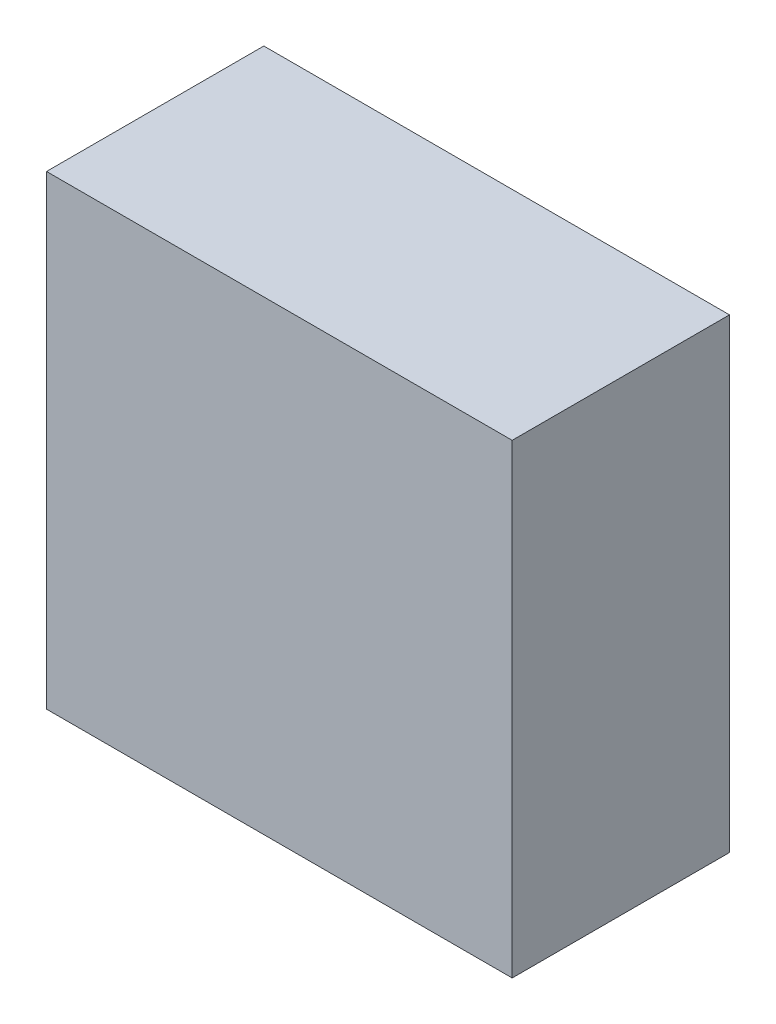
ISO-10303-21;
HEADER;
FILE_DESCRIPTION(('STEP AP214'),'2;1');
FILE_NAME('part.step','',(''),(''),'','','');
FILE_SCHEMA(('AUTOMOTIVE_DESIGN { 1 0 10303 214 1 1 1 1 }'));
ENDSEC;
DATA;
#1=APPLICATION_CONTEXT('core data for automotive mechanical design processes');
#2=APPLICATION_PROTOCOL_DEFINITION('international standard','automotive_design',2000,#1);
#3=PRODUCT_CONTEXT('',#1,'mechanical');
#4=PRODUCT('Part','Part','',(#3));
#5=PRODUCT_RELATED_PRODUCT_CATEGORY('part','',(#4));
#6=PRODUCT_DEFINITION_FORMATION('','',#4);
#7=PRODUCT_DEFINITION_CONTEXT('part definition',#1,'design');
#8=PRODUCT_DEFINITION('design','',#6,#7);
#9=PRODUCT_DEFINITION_SHAPE('','',#8);
#10=(LENGTH_UNIT() NAMED_UNIT(*) SI_UNIT(.MILLI.,.METRE.));
#11=(NAMED_UNIT(*) PLANE_ANGLE_UNIT() SI_UNIT($,.RADIAN.));
#12=(NAMED_UNIT(*) SI_UNIT($,.STERADIAN.) SOLID_ANGLE_UNIT());
#13=UNCERTAINTY_MEASURE_WITH_UNIT(LENGTH_MEASURE(1.E-05),#10,'distance_accuracy_value','');
#14=(GEOMETRIC_REPRESENTATION_CONTEXT(3) GLOBAL_UNCERTAINTY_ASSIGNED_CONTEXT((#13)) GLOBAL_UNIT_ASSIGNED_CONTEXT((#10,
#11,#12)) REPRESENTATION_CONTEXT('',''));
#15=CARTESIAN_POINT('',(0.,0.,0.));
#16=DIRECTION('',(0.,0.,1.));
#17=DIRECTION('',(1.,0.,0.));
#18=AXIS2_PLACEMENT_3D('',#15,#16,#17);
#19=CARTESIAN_POINT('',(0.,0.,35.));
#20=DIRECTION('',(1.,0.,0.));
#21=DIRECTION('',(0.,0.,-1.));
#22=AXIS2_PLACEMENT_3D('',#19,#20,#21);
#23=PLANE('',#22);
#24=DIRECTION('',(0.,-1.,0.));
#25=VECTOR('',#24,1.);
#26=CARTESIAN_POINT('',(0.,0.,0.));
#27=LINE('',#26,#25);
#28=CARTESIAN_POINT('',(0.,75.,0.));
#29=VERTEX_POINT('',#28);
#30=CARTESIAN_POINT('',(0.,0.,0.));
#31=VERTEX_POINT('',#30);
#32=EDGE_CURVE('E97',#29,#31,#27,.T.);
#33=ORIENTED_EDGE('',*,*,#32,.T.);
#34=DIRECTION('',(0.,0.,-1.));
#35=VECTOR('',#34,1.);
#36=CARTESIAN_POINT('',(0.,0.,35.));
#37=LINE('',#36,#35);
#38=CARTESIAN_POINT('',(0.,0.,35.));
#39=VERTEX_POINT('',#38);
#40=EDGE_CURVE('E11',#39,#31,#37,.T.);
#41=ORIENTED_EDGE('',*,*,#40,.F.);
#42=DIRECTION('',(0.,-1.,0.));
#43=VECTOR('',#42,1.);
#44=CARTESIAN_POINT('',(0.,0.,35.));
#45=LINE('',#44,#43);
#46=CARTESIAN_POINT('',(0.,75.,35.));
#47=VERTEX_POINT('',#46);
#48=EDGE_CURVE('E85',#47,#39,#45,.T.);
#49=ORIENTED_EDGE('',*,*,#48,.F.);
#50=DIRECTION('',(0.,0.,-1.));
#51=VECTOR('',#50,1.);
#52=CARTESIAN_POINT('',(0.,75.,35.));
#53=LINE('',#52,#51);
#54=EDGE_CURVE('E93',#47,#29,#53,.T.);
#55=ORIENTED_EDGE('',*,*,#54,.T.);
#56=EDGE_LOOP('',(#33,#41,#49,#55));
#57=FACE_BOUND('',#56,.T.);
#58=ADVANCED_FACE('F34',(#57),#23,.F.);
#59=CARTESIAN_POINT('',(0.,0.,35.));
#60=DIRECTION('',(0.,1.,0.));
#61=DIRECTION('',(0.,0.,1.));
#62=AXIS2_PLACEMENT_3D('',#59,#60,#61);
#63=PLANE('',#62);
#64=DIRECTION('',(1.,0.,0.));
#65=VECTOR('',#64,1.);
#66=CARTESIAN_POINT('',(0.,0.,0.));
#67=LINE('',#66,#65);
#68=CARTESIAN_POINT('',(75.,0.,0.));
#69=VERTEX_POINT('',#68);
#70=EDGE_CURVE('E89',#31,#69,#67,.T.);
#71=ORIENTED_EDGE('',*,*,#70,.T.);
#72=DIRECTION('',(0.,0.,-1.));
#73=VECTOR('',#72,1.);
#74=CARTESIAN_POINT('',(75.,0.,35.));
#75=LINE('',#74,#73);
#76=CARTESIAN_POINT('',(75.,0.,35.));
#77=VERTEX_POINT('',#76);
#78=EDGE_CURVE('E42',#77,#69,#75,.T.);
#79=ORIENTED_EDGE('',*,*,#78,.F.);
#80=DIRECTION('',(1.,0.,0.));
#81=VECTOR('',#80,1.);
#82=CARTESIAN_POINT('',(0.,0.,35.));
#83=LINE('',#82,#81);
#84=EDGE_CURVE('E80',#39,#77,#83,.T.);
#85=ORIENTED_EDGE('',*,*,#84,.F.);
#86=ORIENTED_EDGE('',*,*,#40,.T.);
#87=EDGE_LOOP('',(#71,#79,#85,#86));
#88=FACE_BOUND('',#87,.T.);
#89=ADVANCED_FACE('F88',(#88),#63,.F.);
#90=CARTESIAN_POINT('',(75.,0.,35.));
#91=DIRECTION('',(-1.,0.,0.));
#92=DIRECTION('',(0.,0.,1.));
#93=AXIS2_PLACEMENT_3D('',#90,#91,#92);
#94=PLANE('',#93);
#95=DIRECTION('',(0.,1.,0.));
#96=VECTOR('',#95,1.);
#97=CARTESIAN_POINT('',(75.,0.,0.));
#98=LINE('',#97,#96);
#99=CARTESIAN_POINT('',(75.,75.,0.));
#100=VERTEX_POINT('',#99);
#101=EDGE_CURVE('E67',#69,#100,#98,.T.);
#102=ORIENTED_EDGE('',*,*,#101,.T.);
#103=DIRECTION('',(0.,0.,-1.));
#104=VECTOR('',#103,1.);
#105=CARTESIAN_POINT('',(75.,75.,35.));
#106=LINE('',#105,#104);
#107=CARTESIAN_POINT('',(75.,75.,35.));
#108=VERTEX_POINT('',#107);
#109=EDGE_CURVE('E90',#108,#100,#106,.T.);
#110=ORIENTED_EDGE('',*,*,#109,.F.);
#111=DIRECTION('',(0.,1.,0.));
#112=VECTOR('',#111,1.);
#113=CARTESIAN_POINT('',(75.,0.,35.));
#114=LINE('',#113,#112);
#115=EDGE_CURVE('E83',#77,#108,#114,.T.);
#116=ORIENTED_EDGE('',*,*,#115,.F.);
#117=ORIENTED_EDGE('',*,*,#78,.T.);
#118=EDGE_LOOP('',(#102,#110,#116,#117));
#119=FACE_BOUND('',#118,.T.);
#120=ADVANCED_FACE('F91',(#119),#94,.F.);
#121=CARTESIAN_POINT('',(0.,75.,35.));
#122=DIRECTION('',(0.,-1.,0.));
#123=DIRECTION('',(0.,0.,-1.));
#124=AXIS2_PLACEMENT_3D('',#121,#122,#123);
#125=PLANE('',#124);
#126=DIRECTION('',(-1.,0.,0.));
#127=VECTOR('',#126,1.);
#128=CARTESIAN_POINT('',(0.,75.,0.));
#129=LINE('',#128,#127);
#130=EDGE_CURVE('E73',#100,#29,#129,.T.);
#131=ORIENTED_EDGE('',*,*,#130,.T.);
#132=ORIENTED_EDGE('',*,*,#54,.F.);
#133=DIRECTION('',(-1.,0.,0.));
#134=VECTOR('',#133,1.);
#135=CARTESIAN_POINT('',(0.,75.,35.));
#136=LINE('',#135,#134);
#137=EDGE_CURVE('E50',#108,#47,#136,.T.);
#138=ORIENTED_EDGE('',*,*,#137,.F.);
#139=ORIENTED_EDGE('',*,*,#109,.T.);
#140=EDGE_LOOP('',(#131,#132,#138,#139));
#141=FACE_BOUND('',#140,.T.);
#142=ADVANCED_FACE('F104',(#141),#125,.F.);
#143=CARTESIAN_POINT('',(0.,0.,35.));
#144=DIRECTION('',(0.,0.,-1.));
#145=DIRECTION('',(-1.,0.,0.));
#146=AXIS2_PLACEMENT_3D('',#143,#144,#145);
#147=PLANE('',#146);
#148=ORIENTED_EDGE('',*,*,#48,.T.);
#149=ORIENTED_EDGE('',*,*,#84,.T.);
#150=ORIENTED_EDGE('',*,*,#115,.T.);
#151=ORIENTED_EDGE('',*,*,#137,.T.);
#152=EDGE_LOOP('',(#148,#149,#150,#151));
#153=FACE_BOUND('',#152,.T.);
#154=ADVANCED_FACE('F81',(#153),#147,.F.);
#155=CARTESIAN_POINT('',(0.,0.,0.));
#156=DIRECTION('',(0.,0.,-1.));
#157=DIRECTION('',(-1.,0.,0.));
#158=AXIS2_PLACEMENT_3D('',#155,#156,#157);
#159=PLANE('',#158);
#160=ORIENTED_EDGE('',*,*,#32,.F.);
#161=ORIENTED_EDGE('',*,*,#130,.F.);
#162=ORIENTED_EDGE('',*,*,#101,.F.);
#163=ORIENTED_EDGE('',*,*,#70,.F.);
#164=EDGE_LOOP('',(#160,#161,#162,#163));
#165=FACE_BOUND('',#164,.T.);
#166=ADVANCED_FACE('F107',(#165),#159,.T.);
#167=CLOSED_SHELL('',(#58,#89,#120,#142,#154,#166));
#168=MANIFOLD_SOLID_BREP('B2',#167);
#169=ADVANCED_BREP_SHAPE_REPRESENTATION('',(#18,#168),#14);
#170=SHAPE_DEFINITION_REPRESENTATION(#9,#169);
ENDSEC;
END-ISO-10303-21;
